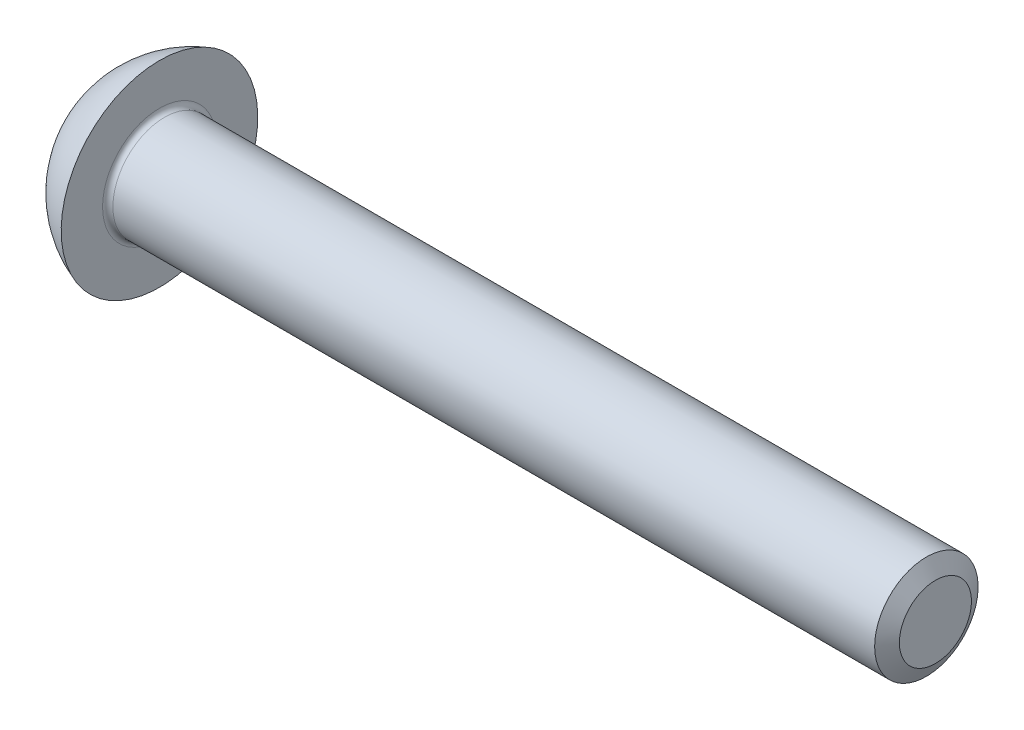
ISO-10303-21;
HEADER;
FILE_DESCRIPTION(('STEP AP214'),'2;1');
FILE_NAME('part.step','',(''),(''),'','','');
FILE_SCHEMA(('AUTOMOTIVE_DESIGN { 1 0 10303 214 1 1 1 1 }'));
ENDSEC;
DATA;
#1=APPLICATION_CONTEXT('core data for automotive mechanical design processes');
#2=APPLICATION_PROTOCOL_DEFINITION('international standard','automotive_design',2000,#1);
#3=PRODUCT_CONTEXT('',#1,'mechanical');
#4=PRODUCT('Part','Part','',(#3));
#5=PRODUCT_RELATED_PRODUCT_CATEGORY('part','',(#4));
#6=PRODUCT_DEFINITION_FORMATION('','',#4);
#7=PRODUCT_DEFINITION_CONTEXT('part definition',#1,'design');
#8=PRODUCT_DEFINITION('design','',#6,#7);
#9=PRODUCT_DEFINITION_SHAPE('','',#8);
#10=(LENGTH_UNIT() NAMED_UNIT(*) SI_UNIT(.MILLI.,.METRE.));
#11=(NAMED_UNIT(*) PLANE_ANGLE_UNIT() SI_UNIT($,.RADIAN.));
#12=(NAMED_UNIT(*) SI_UNIT($,.STERADIAN.) SOLID_ANGLE_UNIT());
#13=UNCERTAINTY_MEASURE_WITH_UNIT(LENGTH_MEASURE(1.E-05),#10,'distance_accuracy_value','');
#14=(GEOMETRIC_REPRESENTATION_CONTEXT(3) GLOBAL_UNCERTAINTY_ASSIGNED_CONTEXT((#13)) GLOBAL_UNIT_ASSIGNED_CONTEXT((#10,
#11,#12)) REPRESENTATION_CONTEXT('',''));
#15=CARTESIAN_POINT('',(0.,0.,0.));
#16=DIRECTION('',(0.,0.,1.));
#17=DIRECTION('',(1.,0.,0.));
#18=AXIS2_PLACEMENT_3D('',#15,#16,#17);
#19=CARTESIAN_POINT('',(-32.2,0.,0.));
#20=DIRECTION('',(-1.,0.,0.));
#21=DIRECTION('',(0.,0.,1.));
#22=AXIS2_PLACEMENT_3D('',#19,#20,#21);
#23=CYLINDRICAL_SURFACE('',#22,2.);
#24=CARTESIAN_POINT('',(-29.8,0.,0.));
#25=DIRECTION('',(-1.,0.,0.));
#26=DIRECTION('',(0.,0.,1.));
#27=AXIS2_PLACEMENT_3D('',#24,#25,#26);
#28=CIRCLE('',#27,2.);
#29=CARTESIAN_POINT('',(-29.8,0.,2.));
#30=VERTEX_POINT('',#29);
#31=EDGE_CURVE('E262',#30,#30,#28,.T.);
#32=ORIENTED_EDGE('',*,*,#31,.F.);
#33=EDGE_LOOP('',(#32));
#34=FACE_BOUND('',#33,.T.);
#35=CARTESIAN_POINT('',(-0.35,0.,0.));
#36=DIRECTION('',(-1.,0.,0.));
#37=DIRECTION('',(0.,0.,1.));
#38=AXIS2_PLACEMENT_3D('',#35,#36,#37);
#39=CIRCLE('',#38,2.);
#40=CARTESIAN_POINT('',(-0.35,0.,2.));
#41=VERTEX_POINT('',#40);
#42=EDGE_CURVE('E449',#41,#41,#39,.T.);
#43=ORIENTED_EDGE('',*,*,#42,.T.);
#44=EDGE_LOOP('',(#43));
#45=FACE_BOUND('',#44,.T.);
#46=ADVANCED_FACE('F41',(#34,#45),#23,.T.);
#47=CARTESIAN_POINT('',(-32.2,0.,0.));
#48=DIRECTION('',(1.,0.,0.));
#49=DIRECTION('',(0.,0.,-1.));
#50=AXIS2_PLACEMENT_3D('',#47,#48,#49);
#51=PLANE('',#50);
#52=CARTESIAN_POINT('',(-32.2,0.,0.));
#53=DIRECTION('',(-1.,0.,0.));
#54=DIRECTION('',(0.,0.,1.));
#55=AXIS2_PLACEMENT_3D('',#52,#53,#54);
#56=CIRCLE('',#55,2.);
#57=CARTESIAN_POINT('',(-32.2,2.,0.));
#58=VERTEX_POINT('',#57);
#59=EDGE_CURVE('E254',#58,#58,#56,.T.);
#60=ORIENTED_EDGE('',*,*,#59,.T.);
#61=EDGE_LOOP('',(#60));
#62=FACE_BOUND('',#61,.T.);
#63=CARTESIAN_POINT('',(-32.2,0.,0.));
#64=DIRECTION('',(1.,0.,0.));
#65=DIRECTION('',(0.,0.,-1.));
#66=AXIS2_PLACEMENT_3D('',#63,#64,#65);
#67=CIRCLE('',#66,1.44337567297406);
#68=CARTESIAN_POINT('',(-32.2,-0.721687836487033,-1.25));
#69=VERTEX_POINT('',#68);
#70=CARTESIAN_POINT('',(-32.2,-1.44337567297406,0.));
#71=VERTEX_POINT('',#70);
#72=EDGE_CURVE('E11',#69,#71,#67,.F.);
#73=ORIENTED_EDGE('',*,*,#72,.F.);
#74=CARTESIAN_POINT('',(-32.2,0.721687836487032,-1.25));
#75=VERTEX_POINT('',#74);
#76=EDGE_CURVE('E45',#75,#69,#67,.F.);
#77=ORIENTED_EDGE('',*,*,#76,.F.);
#78=CARTESIAN_POINT('',(-32.2,1.44337567297406,0.));
#79=VERTEX_POINT('',#78);
#80=EDGE_CURVE('E114',#79,#75,#67,.F.);
#81=ORIENTED_EDGE('',*,*,#80,.F.);
#82=CARTESIAN_POINT('',(-32.2,0.721687836487032,1.25));
#83=VERTEX_POINT('',#82);
#84=EDGE_CURVE('E327',#83,#79,#67,.F.);
#85=ORIENTED_EDGE('',*,*,#84,.F.);
#86=CARTESIAN_POINT('',(-32.2,-0.721687836487031,1.25));
#87=VERTEX_POINT('',#86);
#88=EDGE_CURVE('E50',#87,#83,#67,.F.);
#89=ORIENTED_EDGE('',*,*,#88,.F.);
#90=CARTESIAN_POINT('',(-32.2,0.,0.));
#91=DIRECTION('',(-1.,0.,0.));
#92=DIRECTION('',(0.,-1.,0.));
#93=AXIS2_PLACEMENT_3D('',#90,#91,#92);
#94=CIRCLE('',#93,1.44337567297406);
#95=EDGE_CURVE('E117',#71,#87,#94,.T.);
#96=ORIENTED_EDGE('',*,*,#95,.F.);
#97=EDGE_LOOP('',(#73,#77,#81,#85,#89,#96));
#98=FACE_BOUND('',#97,.T.);
#99=ADVANCED_FACE('F43',(#62,#98),#51,.F.);
#100=CARTESIAN_POINT('',(-28.7272727272727,0.,0.));
#101=DIRECTION('',(-1.,0.,0.));
#102=DIRECTION('',(0.,1.,0.));
#103=AXIS2_PLACEMENT_3D('',#100,#101,#102);
#104=SPHERICAL_SURFACE('',#103,4.00747235932374);
#105=CARTESIAN_POINT('',(-30.,0.,0.));
#106=DIRECTION('',(-1.,0.,0.));
#107=DIRECTION('',(0.,0.,1.));
#108=AXIS2_PLACEMENT_3D('',#105,#106,#107);
#109=CIRCLE('',#108,3.8);
#110=CARTESIAN_POINT('',(-30.,3.8,0.));
#111=VERTEX_POINT('',#110);
#112=EDGE_CURVE('E257',#111,#111,#109,.T.);
#113=CARTESIAN_POINT('',(-32.2,2.,0.));
#114=CARTESIAN_POINT('',(-32.1848940441993,2.02622955900731,0.));
#115=CARTESIAN_POINT('',(-32.1694908144314,2.05228791024859,0.));
#116=CARTESIAN_POINT('',(-32.1380979525594,2.10404896261472,0.));
#117=CARTESIAN_POINT('',(-32.1221083204554,2.12975166373959,0.));
#118=CARTESIAN_POINT('',(-32.0895507995097,2.18078818128854,0.));
#119=CARTESIAN_POINT('',(-32.072982910668,2.20612199771263,0.));
#120=CARTESIAN_POINT('',(-32.0392773993975,2.25640774959029,0.));
#121=CARTESIAN_POINT('',(-32.0221397769687,2.28135968504387,0.));
#122=CARTESIAN_POINT('',(-31.9873035925655,2.33086886166224,0.));
#123=CARTESIAN_POINT('',(-31.9696050305911,2.35542610282703,0.));
#124=CARTESIAN_POINT('',(-31.9336560549214,2.40413328370188,0.));
#125=CARTESIAN_POINT('',(-31.9154056412261,2.42828322341194,0.));
#126=CARTESIAN_POINT('',(-31.8783623317131,2.47616340238235,0.));
#127=CARTESIAN_POINT('',(-31.8595694358953,2.49989364164271,0.));
#128=CARTESIAN_POINT('',(-31.8214508106667,2.54692223644896,0.));
#129=CARTESIAN_POINT('',(-31.8021250812559,2.57022059199485,0.));
#130=CARTESIAN_POINT('',(-31.7629507108208,2.61637345777279,0.));
#131=CARTESIAN_POINT('',(-31.7431020697966,2.63922796800484,0.));
#132=CARTESIAN_POINT('',(-31.7028920666117,2.684481409448,0.));
#133=CARTESIAN_POINT('',(-31.682530704451,2.70688034065911,0.));
#134=CARTESIAN_POINT('',(-31.6413057126977,2.75121112424682,0.));
#135=CARTESIAN_POINT('',(-31.6204420831052,2.77314297662341,0.));
#136=CARTESIAN_POINT('',(-31.5782232680636,2.81652834253228,0.));
#137=CARTESIAN_POINT('',(-31.5568680826145,2.83798185606455,0.));
#138=CARTESIAN_POINT('',(-31.5136771198039,2.88039952985806,0.));
#139=CARTESIAN_POINT('',(-31.4918413424423,2.90136369011931,0.));
#140=CARTESIAN_POINT('',(-31.447700406491,2.94279189418254,0.));
#141=CARTESIAN_POINT('',(-31.4253952479013,2.96325593798452,0.));
#142=CARTESIAN_POINT('',(-31.3803270011625,3.00367340270524,0.));
#143=CARTESIAN_POINT('',(-31.3575639130134,3.02362682362399,0.));
#144=CARTESIAN_POINT('',(-31.3115914939299,3.06301279831263,0.));
#145=CARTESIAN_POINT('',(-31.2883821629955,3.08244535208254,0.));
#146=CARTESIAN_POINT('',(-31.2415291742204,3.12077961562579,0.));
#147=CARTESIAN_POINT('',(-31.2178855163797,3.13968132539914,0.));
#148=CARTESIAN_POINT('',(-31.1701760126585,3.17694419664163,0.));
#149=CARTESIAN_POINT('',(-31.1461101667779,3.19530535811078,0.));
#150=CARTESIAN_POINT('',(-31.0975686425984,3.23147770595957,0.));
#151=CARTESIAN_POINT('',(-31.0730929642995,3.24928889233922,0.));
#152=CARTESIAN_POINT('',(-31.0237443413165,3.28435214558591,0.));
#153=CARTESIAN_POINT('',(-30.9988713966324,3.30160421245294,0.));
#154=CARTESIAN_POINT('',(-30.9487410108723,3.3355403693082,0.));
#155=CARTESIAN_POINT('',(-30.9234835697963,3.35222445929642,0.));
#156=CARTESIAN_POINT('',(-30.8725971586496,3.38501609663248,0.));
#157=CARTESIAN_POINT('',(-30.846968188579,3.40112364398032,0.));
#158=CARTESIAN_POINT('',(-30.7953518775865,3.43275392627554,0.));
#159=CARTESIAN_POINT('',(-30.7693645366645,3.44827666122294,0.));
#160=CARTESIAN_POINT('',(-30.7170448261044,3.47872934920754,0.));
#161=CARTESIAN_POINT('',(-30.6907124564662,3.49365930224475,0.));
#162=CARTESIAN_POINT('',(-30.6377162077463,3.52291876123,0.));
#163=CARTESIAN_POINT('',(-30.6110523286645,3.53724826717803,0.));
#164=CARTESIAN_POINT('',(-30.5574067505418,3.56529947511373,0.));
#165=CARTESIAN_POINT('',(-30.5304250515009,3.57902117710138,0.));
#166=CARTESIAN_POINT('',(-30.4761576860719,3.60584973217452,0.));
#167=CARTESIAN_POINT('',(-30.4488720196837,3.61895658526001,0.));
#168=CARTESIAN_POINT('',(-30.3940107283966,3.6445487137135,0.));
#169=CARTESIAN_POINT('',(-30.3664351034975,3.65703398908152,0.));
#170=CARTESIAN_POINT('',(-30.3110080522769,3.6813765507008,0.));
#171=CARTESIAN_POINT('',(-30.2831566259553,3.69323383695206,0.));
#172=CARTESIAN_POINT('',(-30.2271922728732,3.71631433772655,0.));
#173=CARTESIAN_POINT('',(-30.1990793461126,3.72753755224977,0.));
#174=CARTESIAN_POINT('',(-30.1426064188229,3.74934412871163,0.));
#175=CARTESIAN_POINT('',(-30.1142464182937,3.75992749065027,0.));
#176=CARTESIAN_POINT('',(-30.0572939289701,3.78044899835327,0.));
#177=CARTESIAN_POINT('',(-30.0287014401756,3.79038714411763,0.));
#178=CARTESIAN_POINT('',(-30.,3.8,0.));
#179=B_SPLINE_CURVE_WITH_KNOTS('',3,(#113,#114,#115,#116,#117,#118,#119,#120,#121,#122,#123,
#124,#125,#126,#127,#128,#129,#130,#131,#132,#133,#134,#135,#136,#137,#138,#139,#140,#141,#142,
#143,#144,#145,#146,#147,#148,#149,#150,#151,#152,#153,#154,#155,#156,#157,#158,#159,#160,#161,
#162,#163,#164,#165,#166,#167,#168,#169,#170,#171,#172,#173,#174,#175,#176,#177,#178),
.UNSPECIFIED.,.F.,.F.,(4,2,2,2,2,2,2,2,2,2,2,2,2,2,2,2,2,2,2,2,2,2,2,2,2,2,2,2,2,2,2,2,4),(0.,
0.0908034330338798,0.181606866067759,0.272410299101639,0.36321373213552,0.454017165169397,
0.544820598203278,0.635624031237157,0.726427464271038,0.817230897304916,0.908034330338795,
0.998837763372676,1.08964119640655,1.18044462944043,1.27124806247431,1.36205149550819,
1.45285492854207,1.54365836157595,1.63446179460983,1.72526522764371,1.81606866067759,
1.90687209371147,1.99767552674535,2.08847895977923,2.17928239281311,2.27008582584699,
2.36088925888087,2.45169269191474,2.54249612494862,2.6332995579825,2.72410299101638,
2.81490642405026,2.90570985708414),.UNSPECIFIED.);
#180=EDGE_CURVE('BSEAM243',#58,#111,#179,.T.);
#181=ORIENTED_EDGE('',*,*,#59,.F.);
#182=ORIENTED_EDGE('',*,*,#112,.T.);
#183=ORIENTED_EDGE('',*,*,#180,.T.);
#184=ORIENTED_EDGE('',*,*,#180,.F.);
#185=EDGE_LOOP('',(#181,#183,#182,#184));
#186=FACE_BOUND('',#185,.T.);
#187=ADVANCED_FACE('F243',(#186),#104,.T.);
#188=CARTESIAN_POINT('',(-30.,2.2,0.));
#189=DIRECTION('',(-1.,0.,0.));
#190=DIRECTION('',(0.,0.,1.));
#191=AXIS2_PLACEMENT_3D('',#188,#189,#190);
#192=PLANE('',#191);
#193=ORIENTED_EDGE('',*,*,#112,.F.);
#194=EDGE_LOOP('',(#193));
#195=FACE_BOUND('',#194,.T.);
#196=CARTESIAN_POINT('',(-30.,0.,0.));
#197=DIRECTION('',(-1.,0.,0.));
#198=DIRECTION('',(0.,0.,1.));
#199=AXIS2_PLACEMENT_3D('',#196,#197,#198);
#200=CIRCLE('',#199,2.2);
#201=CARTESIAN_POINT('',(-30.,0.,2.2));
#202=VERTEX_POINT('',#201);
#203=EDGE_CURVE('E258',#202,#202,#200,.T.);
#204=ORIENTED_EDGE('',*,*,#203,.T.);
#205=EDGE_LOOP('',(#204));
#206=FACE_BOUND('',#205,.T.);
#207=ADVANCED_FACE('F240',(#195,#206),#192,.F.);
#208=CARTESIAN_POINT('',(-29.8,0.,0.));
#209=DIRECTION('',(-1.,0.,0.));
#210=DIRECTION('',(0.,0.,1.));
#211=AXIS2_PLACEMENT_3D('',#208,#209,#210);
#212=TOROIDAL_SURFACE('',#211,2.2,0.200000000000001);
#213=ORIENTED_EDGE('',*,*,#203,.F.);
#214=EDGE_LOOP('',(#213));
#215=FACE_BOUND('',#214,.T.);
#216=ORIENTED_EDGE('',*,*,#31,.T.);
#217=EDGE_LOOP('',(#216));
#218=FACE_BOUND('',#217,.T.);
#219=ADVANCED_FACE('F237',(#215,#218),#212,.F.);
#220=CARTESIAN_POINT('',(-31.83,0.,0.));
#221=DIRECTION('',(-1.,0.,0.));
#222=DIRECTION('',(0.,-1.,0.));
#223=AXIS2_PLACEMENT_3D('',#220,#221,#222);
#224=CONICAL_SURFACE('',#223,0.,1.31985626102756);
#225=CARTESIAN_POINT('',(-32.4099346759325,-1.88564456107599,-1.25));
#226=CARTESIAN_POINT('',(-32.3978717207476,-1.82917708741649,-1.25));
#227=CARTESIAN_POINT('',(-32.3859628503841,-1.7726766725723,-1.25));
#228=CARTESIAN_POINT('',(-32.3625309817374,-1.65959353753871,-1.25));
#229=CARTESIAN_POINT('',(-32.3510079994509,-1.60301081403846,-1.25));
#230=CARTESIAN_POINT('',(-32.3171150455956,-1.43301680255399,-1.25));
#231=CARTESIAN_POINT('',(-32.2954436732229,-1.31946408423816,-1.25));
#232=CARTESIAN_POINT('',(-32.2550957638519,-1.09274070822473,-1.25));
#233=CARTESIAN_POINT('',(-32.2363969731627,-0.979574090908787,-1.25));
#234=CARTESIAN_POINT('',(-32.2032623365578,-0.752620098767595,-1.25));
#235=CARTESIAN_POINT('',(-32.188825705465,-0.638832842215424,-1.25));
#236=CARTESIAN_POINT('',(-32.1660896767959,-0.409425109570645,-1.25));
#237=CARTESIAN_POINT('',(-32.1578544497063,-0.293797778292055,-1.25));
#238=CARTESIAN_POINT('',(-32.1515679025376,-0.120164512871691,-1.25));
#239=CARTESIAN_POINT('',(-32.150483164521,-0.06226279286971,-1.25));
#240=CARTESIAN_POINT('',(-32.1503795328621,0.0535425643634284,-1.25));
#241=CARTESIAN_POINT('',(-32.15136064136,0.11144620159651,-1.25));
#242=CARTESIAN_POINT('',(-32.1573598650309,0.285474295611227,-1.25));
#243=CARTESIAN_POINT('',(-32.1654487463646,0.401498867331895,-1.25));
#244=CARTESIAN_POINT('',(-32.1881044285101,0.632939913567419,-1.25));
#245=CARTESIAN_POINT('',(-32.2026754362751,0.748355943831211,-1.25));
#246=CARTESIAN_POINT('',(-32.2365518645336,0.980878548339561,-1.25));
#247=CARTESIAN_POINT('',(-32.2559479393881,1.09797147869704,-1.25));
#248=CARTESIAN_POINT('',(-32.2976947052089,1.33163516353435,-1.25));
#249=CARTESIAN_POINT('',(-32.3200458280349,1.44820583911091,-1.25));
#250=CARTESIAN_POINT('',(-32.3666691464558,1.68099121637415,-1.25));
#251=CARTESIAN_POINT('',(-32.3909418646374,1.7972058122361,-1.25));
#252=CARTESIAN_POINT('',(-32.4407644332086,2.02936144854685,-1.25));
#253=CARTESIAN_POINT('',(-32.4663143094331,2.14530248341221,-1.25));
#254=CARTESIAN_POINT('',(-32.518006571917,2.37571314631909,-1.25));
#255=CARTESIAN_POINT('',(-32.5441393559518,2.49018493743662,-1.25));
#256=CARTESIAN_POINT('',(-32.5970181249123,2.71898894131965,-1.25));
#257=CARTESIAN_POINT('',(-32.6237641225282,2.83332115114489,-1.25));
#258=CARTESIAN_POINT('',(-32.6776683130688,3.06173187864781,-1.25));
#259=CARTESIAN_POINT('',(-32.7048259274931,3.17581053313172,-1.25));
#260=CARTESIAN_POINT('',(-32.7594820608418,3.40388218743046,-1.25));
#261=CARTESIAN_POINT('',(-32.7869805683896,3.51787518996983,-1.25));
#262=CARTESIAN_POINT('',(-32.8145979060137,3.63183906574753,-1.25));
#263=B_SPLINE_CURVE_WITH_KNOTS('',3,(#225,#226,#227,#228,#229,#230,#231,#232,#233,#234,#235,
#236,#237,#238,#239,#240,#241,#242,#243,#244,#245,#246,#247,#248,#249,#250,#251,#252,#253,#254,
#255,#256,#257,#258,#259,#260,#261,#262),.UNSPECIFIED.,.F.,.F.,(4,2,2,2,2,2,2,2,2,2,2,2,2,2,2,2,
2,2,4),(0.,0.173224298995283,0.346455770019721,0.69323917118921,1.03728991141695,
1.38127723083866,1.72877689604066,1.90247833739643,2.07617995870962,2.42483219738435,
2.77371104508348,3.12971850144864,3.48577804345033,3.84193475233926,4.19809866864176,
4.55034691705481,4.90260246171337,5.25440194240086,5.60618971383706),.UNSPECIFIED.);
#264=EDGE_CURVE('E105',#69,#75,#263,.T.);
#265=ORIENTED_EDGE('',*,*,#264,.T.);
#266=ORIENTED_EDGE('',*,*,#76,.T.);
#267=EDGE_LOOP('',(#265,#266));
#268=FACE_BOUND('',#267,.T.);
#269=ADVANCED_FACE('F109',(#268),#224,.F.);
#270=CARTESIAN_POINT('',(-32.2000296035517,0.721572366433194,-1.2502));
#271=CARTESIAN_POINT('',(-32.1923376245114,0.751560236122211,-1.19825948608787));
#272=CARTESIAN_POINT('',(-32.1853558988612,0.781597955311094,-1.14623263030924));
#273=CARTESIAN_POINT('',(-32.1730912390252,0.841770545746216,-1.04201064645257));
#274=CARTESIAN_POINT('',(-32.1678089341386,0.871905448817342,-0.989815463252219));
#275=CARTESIAN_POINT('',(-32.1592477971586,0.932104975245319,-0.885546824887376));
#276=CARTESIAN_POINT('',(-32.1559596086559,0.96216925702196,-0.833473961357168));
#277=CARTESIAN_POINT('',(-32.1515506008694,1.0223329488635,-0.729267390316703));
#278=CARTESIAN_POINT('',(-32.1504293994002,1.05243235179702,-0.677133695158352));
#279=CARTESIAN_POINT('',(-32.1504293994002,1.11263115766407,-0.572866304841649));
#280=CARTESIAN_POINT('',(-32.1515506008694,1.1427305605976,-0.520732609683297));
#281=CARTESIAN_POINT('',(-32.1559596086559,1.20289425243914,-0.416526038642832));
#282=CARTESIAN_POINT('',(-32.1592477971586,1.23295853421578,-0.364453175112624));
#283=CARTESIAN_POINT('',(-32.1678089341386,1.29315806064375,-0.260184536747782));
#284=CARTESIAN_POINT('',(-32.1730912390252,1.32329296371488,-0.207989353547428));
#285=CARTESIAN_POINT('',(-32.1853558988612,1.38346555415,-0.103767369690763));
#286=CARTESIAN_POINT('',(-32.1923376245114,1.41350327333889,-0.0517405139121324));
#287=CARTESIAN_POINT('',(-32.2000296035517,1.4434911430279,0.000199999999999419));
#288=B_SPLINE_CURVE_WITH_KNOTS('',3,(#270,#271,#272,#273,#274,#275,#276,#277,#278,#279,#280,
#281,#282,#283,#284,#285,#286,#287),.UNSPECIFIED.,.F.,.F.,(4,2,2,2,2,2,2,2,4),(0.,
0.181409592460798,0.362886284169926,0.543504761741732,0.724091381228726,0.90467800071572,
1.08529647828753,1.26677316999665,1.44818276245745),.UNSPECIFIED.);
#289=EDGE_CURVE('E133',#75,#79,#288,.T.);
#290=ORIENTED_EDGE('',*,*,#289,.T.);
#291=ORIENTED_EDGE('',*,*,#80,.T.);
#292=EDGE_LOOP('',(#290,#291));
#293=FACE_BOUND('',#292,.T.);
#294=ADVANCED_FACE('F161',(#293),#224,.F.);
#295=CARTESIAN_POINT('',(-32.2000296035517,1.4434911430279,-0.00019999999999983));
#296=CARTESIAN_POINT('',(-32.1923376245114,1.41350327333889,0.0517405139121321));
#297=CARTESIAN_POINT('',(-32.1853558988612,1.38346555415,0.103767369690763));
#298=CARTESIAN_POINT('',(-32.1730912390252,1.32329296371488,0.207989353547427));
#299=CARTESIAN_POINT('',(-32.1678089341386,1.29315806064375,0.260184536747781));
#300=CARTESIAN_POINT('',(-32.1592477971586,1.23295853421578,0.364453175112623));
#301=CARTESIAN_POINT('',(-32.1559596086559,1.20289425243914,0.416526038642832));
#302=CARTESIAN_POINT('',(-32.1515506008694,1.1427305605976,0.520732609683296));
#303=CARTESIAN_POINT('',(-32.1504293994002,1.11263115766407,0.572866304841648));
#304=CARTESIAN_POINT('',(-32.1504293994002,1.05243235179702,0.677133695158351));
#305=CARTESIAN_POINT('',(-32.1515506008694,1.0223329488635,0.729267390316703));
#306=CARTESIAN_POINT('',(-32.1559596086559,0.96216925702196,0.833473961357167));
#307=CARTESIAN_POINT('',(-32.1592477971586,0.93210497524532,0.885546824887375));
#308=CARTESIAN_POINT('',(-32.1678089341386,0.871905448817342,0.989815463252218));
#309=CARTESIAN_POINT('',(-32.1730912390252,0.841770545746216,1.04201064645257));
#310=CARTESIAN_POINT('',(-32.1853558988612,0.781597955311094,1.14623263030924));
#311=CARTESIAN_POINT('',(-32.1923376245114,0.751560236122212,1.19825948608787));
#312=CARTESIAN_POINT('',(-32.2000296035517,0.721572366433195,1.2502));
#313=B_SPLINE_CURVE_WITH_KNOTS('',3,(#295,#296,#297,#298,#299,#300,#301,#302,#303,#304,#305,
#306,#307,#308,#309,#310,#311,#312),.UNSPECIFIED.,.F.,.F.,(4,2,2,2,2,2,2,2,4),(0.,
0.181409592460798,0.362886284169926,0.543504761741731,0.724091381228726,0.904678000715719,
1.08529647828752,1.26677316999665,1.44818276245745),.UNSPECIFIED.);
#314=EDGE_CURVE('E183',#79,#83,#313,.T.);
#315=ORIENTED_EDGE('',*,*,#314,.T.);
#316=ORIENTED_EDGE('',*,*,#84,.T.);
#317=EDGE_LOOP('',(#315,#316));
#318=FACE_BOUND('',#317,.T.);
#319=ADVANCED_FACE('F155',(#318),#224,.F.);
#320=CARTESIAN_POINT('',(-32.4099346759325,-1.88564456107599,1.25));
#321=CARTESIAN_POINT('',(-32.3978717207476,-1.82917708741649,1.25));
#322=CARTESIAN_POINT('',(-32.3859628503841,-1.7726766725723,1.25));
#323=CARTESIAN_POINT('',(-32.3625309817374,-1.65959353753871,1.25));
#324=CARTESIAN_POINT('',(-32.3510079994509,-1.60301081403846,1.25));
#325=CARTESIAN_POINT('',(-32.3171150455956,-1.43301680255399,1.25));
#326=CARTESIAN_POINT('',(-32.2954436732229,-1.31946408423816,1.25));
#327=CARTESIAN_POINT('',(-32.2550957638519,-1.09274070822473,1.25));
#328=CARTESIAN_POINT('',(-32.2363969731627,-0.979574090908786,1.25));
#329=CARTESIAN_POINT('',(-32.2032623365578,-0.752620098767593,1.25));
#330=CARTESIAN_POINT('',(-32.188825705465,-0.638832842215423,1.25));
#331=CARTESIAN_POINT('',(-32.1660896767959,-0.409425109570646,1.25));
#332=CARTESIAN_POINT('',(-32.1578544497063,-0.293797778292056,1.25));
#333=CARTESIAN_POINT('',(-32.1515679025376,-0.120164512871691,1.25));
#334=CARTESIAN_POINT('',(-32.150483164521,-0.0622627928697106,1.25));
#335=CARTESIAN_POINT('',(-32.1503795328621,0.0535425643634277,1.25));
#336=CARTESIAN_POINT('',(-32.15136064136,0.111446201596509,1.25));
#337=CARTESIAN_POINT('',(-32.1573598650309,0.285474295611226,1.25));
#338=CARTESIAN_POINT('',(-32.1654487463646,0.401498867331894,1.25));
#339=CARTESIAN_POINT('',(-32.1881044285101,0.632939913567419,1.25));
#340=CARTESIAN_POINT('',(-32.2026754362751,0.748355943831211,1.25));
#341=CARTESIAN_POINT('',(-32.2365518645336,0.980878548339561,1.25));
#342=CARTESIAN_POINT('',(-32.2559479393881,1.09797147869704,1.25));
#343=CARTESIAN_POINT('',(-32.2976947052089,1.33163516353435,1.25));
#344=CARTESIAN_POINT('',(-32.3200458280349,1.44820583911091,1.25));
#345=CARTESIAN_POINT('',(-32.3666691464558,1.68099121637415,1.25));
#346=CARTESIAN_POINT('',(-32.3909418646374,1.7972058122361,1.25));
#347=CARTESIAN_POINT('',(-32.4407644332086,2.02936144854685,1.25));
#348=CARTESIAN_POINT('',(-32.4663143094331,2.14530248341221,1.25));
#349=CARTESIAN_POINT('',(-32.518006571917,2.37571314631909,1.25));
#350=CARTESIAN_POINT('',(-32.5441393559518,2.49018493743662,1.25));
#351=CARTESIAN_POINT('',(-32.5970181249123,2.71898894131965,1.25));
#352=CARTESIAN_POINT('',(-32.6237641225282,2.83332115114489,1.25));
#353=CARTESIAN_POINT('',(-32.6776683130688,3.06173187864781,1.25));
#354=CARTESIAN_POINT('',(-32.7048259274931,3.17581053313172,1.25));
#355=CARTESIAN_POINT('',(-32.7594820608418,3.40388218743046,1.25));
#356=CARTESIAN_POINT('',(-32.7869805683896,3.51787518996983,1.25));
#357=CARTESIAN_POINT('',(-32.8145979060137,3.63183906574753,1.25));
#358=B_SPLINE_CURVE_WITH_KNOTS('',3,(#320,#321,#322,#323,#324,#325,#326,#327,#328,#329,#330,
#331,#332,#333,#334,#335,#336,#337,#338,#339,#340,#341,#342,#343,#344,#345,#346,#347,#348,#349,
#350,#351,#352,#353,#354,#355,#356,#357),.UNSPECIFIED.,.F.,.F.,(4,2,2,2,2,2,2,2,2,2,2,2,2,2,2,2,
2,2,4),(0.,0.173224298995283,0.346455770019721,0.69323917118921,1.03728991141696,
1.38127723083866,1.72877689604066,1.90247833739643,2.07617995870962,2.42483219738435,
2.77371104508348,3.12971850144864,3.48577804345033,3.84193475233926,4.19809866864176,
4.55034691705481,4.90260246171337,5.25440194240086,5.60618971383706),.UNSPECIFIED.);
#359=EDGE_CURVE('E62',#83,#87,#358,.F.);
#360=ORIENTED_EDGE('',*,*,#359,.T.);
#361=ORIENTED_EDGE('',*,*,#88,.T.);
#362=EDGE_LOOP('',(#360,#361));
#363=FACE_BOUND('',#362,.T.);
#364=ADVANCED_FACE('F160',(#363),#224,.F.);
#365=CARTESIAN_POINT('',(-32.2000296035517,-0.721572366433195,1.2502));
#366=CARTESIAN_POINT('',(-32.1923376245114,-0.751560236122212,1.19825948608787));
#367=CARTESIAN_POINT('',(-32.1853558988612,-0.781597955311095,1.14623263030924));
#368=CARTESIAN_POINT('',(-32.1730912390252,-0.841770545746217,1.04201064645257));
#369=CARTESIAN_POINT('',(-32.1678089341386,-0.871905448817343,0.989815463252219));
#370=CARTESIAN_POINT('',(-32.1592477971586,-0.93210497524532,0.885546824887376));
#371=CARTESIAN_POINT('',(-32.1559596086559,-0.962169257021961,0.833473961357168));
#372=CARTESIAN_POINT('',(-32.1515506008694,-1.0223329488635,0.729267390316703));
#373=CARTESIAN_POINT('',(-32.1504293994002,-1.05243235179702,0.677133695158351));
#374=CARTESIAN_POINT('',(-32.1504293994002,-1.11263115766407,0.572866304841648));
#375=CARTESIAN_POINT('',(-32.1515506008694,-1.1427305605976,0.520732609683297));
#376=CARTESIAN_POINT('',(-32.1559596086559,-1.20289425243914,0.416526038642832));
#377=CARTESIAN_POINT('',(-32.1592477971586,-1.23295853421578,0.364453175112623));
#378=CARTESIAN_POINT('',(-32.1678089341386,-1.29315806064376,0.260184536747781));
#379=CARTESIAN_POINT('',(-32.1730912390252,-1.32329296371488,0.207989353547428));
#380=CARTESIAN_POINT('',(-32.1853558988612,-1.38346555415,0.103767369690763));
#381=CARTESIAN_POINT('',(-32.1923376245114,-1.41350327333889,0.0517405139121318));
#382=CARTESIAN_POINT('',(-32.2000296035517,-1.4434911430279,-0.000200000000000009));
#383=B_SPLINE_CURVE_WITH_KNOTS('',3,(#365,#366,#367,#368,#369,#370,#371,#372,#373,#374,#375,
#376,#377,#378,#379,#380,#381,#382),.UNSPECIFIED.,.F.,.F.,(4,2,2,2,2,2,2,2,4),(0.,
0.181409592460797,0.362886284169926,0.543504761741732,0.724091381228726,0.90467800071572,
1.08529647828753,1.26677316999665,1.44818276245745),.UNSPECIFIED.);
#384=EDGE_CURVE('E56',#87,#71,#383,.T.);
#385=ORIENTED_EDGE('',*,*,#384,.T.);
#386=ORIENTED_EDGE('',*,*,#95,.T.);
#387=EDGE_LOOP('',(#385,#386));
#388=FACE_BOUND('',#387,.T.);
#389=ADVANCED_FACE('F314',(#388),#224,.F.);
#390=CARTESIAN_POINT('',(-32.2000296035517,-1.4434911430279,0.000199999999999256));
#391=CARTESIAN_POINT('',(-32.1923376245114,-1.41350327333889,-0.0517405139121324));
#392=CARTESIAN_POINT('',(-32.1853558988612,-1.38346555415,-0.103767369690763));
#393=CARTESIAN_POINT('',(-32.1730912390252,-1.32329296371488,-0.207989353547428));
#394=CARTESIAN_POINT('',(-32.1678089341386,-1.29315806064376,-0.260184536747782));
#395=CARTESIAN_POINT('',(-32.1592477971586,-1.23295853421578,-0.364453175112624));
#396=CARTESIAN_POINT('',(-32.1559596086559,-1.20289425243914,-0.416526038642832));
#397=CARTESIAN_POINT('',(-32.1515506008694,-1.1427305605976,-0.520732609683297));
#398=CARTESIAN_POINT('',(-32.1504293994002,-1.11263115766407,-0.572866304841649));
#399=CARTESIAN_POINT('',(-32.1504293994002,-1.05243235179703,-0.677133695158352));
#400=CARTESIAN_POINT('',(-32.1515506008694,-1.0223329488635,-0.729267390316703));
#401=CARTESIAN_POINT('',(-32.1559596086559,-0.962169257021961,-0.833473961357168));
#402=CARTESIAN_POINT('',(-32.1592477971586,-0.93210497524532,-0.885546824887376));
#403=CARTESIAN_POINT('',(-32.1678089341386,-0.871905448817343,-0.989815463252219));
#404=CARTESIAN_POINT('',(-32.1730912390252,-0.841770545746217,-1.04201064645257));
#405=CARTESIAN_POINT('',(-32.1853558988612,-0.781597955311095,-1.14623263030924));
#406=CARTESIAN_POINT('',(-32.1923376245114,-0.751560236122212,-1.19825948608787));
#407=CARTESIAN_POINT('',(-32.2000296035517,-0.721572366433195,-1.2502));
#408=B_SPLINE_CURVE_WITH_KNOTS('',3,(#390,#391,#392,#393,#394,#395,#396,#397,#398,#399,#400,
#401,#402,#403,#404,#405,#406,#407),.UNSPECIFIED.,.F.,.F.,(4,2,2,2,2,2,2,2,4),(0.,
0.181409592460797,0.362886284169926,0.543504761741732,0.724091381228726,0.90467800071572,
1.08529647828752,1.26677316999665,1.44818276245745),.UNSPECIFIED.);
#409=EDGE_CURVE('E97',#71,#69,#408,.T.);
#410=ORIENTED_EDGE('',*,*,#409,.T.);
#411=ORIENTED_EDGE('',*,*,#72,.T.);
#412=EDGE_LOOP('',(#410,#411));
#413=FACE_BOUND('',#412,.T.);
#414=ADVANCED_FACE('F99',(#413),#224,.F.);
#415=CARTESIAN_POINT('',(-30.9,0.,0.));
#416=DIRECTION('',(-1.,0.,0.));
#417=DIRECTION('',(0.,0.,1.));
#418=AXIS2_PLACEMENT_3D('',#415,#416,#417);
#419=CONICAL_SURFACE('',#418,1.44337567297406,1.01324881882863);
#420=CARTESIAN_POINT('',(-30.,0.,0.));
#421=VERTEX_POINT('',#420);
#422=VERTEX_LOOP('',#421);
#423=FACE_BOUND('',#422,.T.);
#424=CARTESIAN_POINT('',(-31.3527945795421,-1.77325319370587,1.25));
#425=CARTESIAN_POINT('',(-31.3272313608337,-1.72308054748254,1.25));
#426=CARTESIAN_POINT('',(-31.3019425610441,-1.67276579739611,1.25));
#427=CARTESIAN_POINT('',(-31.2520602884769,-1.57178113050656,1.25));
#428=CARTESIAN_POINT('',(-31.2274669508561,-1.52111114702254,1.25));
#429=CARTESIAN_POINT('',(-31.1789832389279,-1.41905106562435,1.25));
#430=CARTESIAN_POINT('',(-31.1550981267071,-1.36765845463947,1.25));
#431=CARTESIAN_POINT('',(-31.1084115654387,-1.26438731533743,1.25));
#432=CARTESIAN_POINT('',(-31.0856100580289,-1.21250881337054,1.25));
#433=CARTESIAN_POINT('',(-31.0180066296141,-1.05318865262781,1.25));
#434=CARTESIAN_POINT('',(-30.975348048821,-0.944818595736525,1.25));
#435=CARTESIAN_POINT('',(-30.899249765014,-0.725021793662279,1.25));
#436=CARTESIAN_POINT('',(-30.8657864364544,-0.613603706258271,1.25));
#437=CARTESIAN_POINT('',(-30.8255224000706,-0.439829475428557,1.25));
#438=CARTESIAN_POINT('',(-30.8135539759356,-0.378686784718629,1.25));
#439=CARTESIAN_POINT('',(-30.7946834115852,-0.255611326700577,1.25));
#440=CARTESIAN_POINT('',(-30.7877804723348,-0.19367868556883,1.25));
#441=CARTESIAN_POINT('',(-30.7797277447971,-0.0702459018996858,1.25));
#442=CARTESIAN_POINT('',(-30.7785036595021,-0.00875074655362735,1.25));
#443=CARTESIAN_POINT('',(-30.7817252928589,0.114091468273714,1.25));
#444=CARTESIAN_POINT('',(-30.7861717520863,0.175438507362529,1.25));
#445=CARTESIAN_POINT('',(-30.802790821166,0.318793774562431,1.25));
#446=CARTESIAN_POINT('',(-30.8171162097553,0.400550507800211,1.25));
#447=CARTESIAN_POINT('',(-30.8533604743273,0.56235775953531,1.25));
#448=CARTESIAN_POINT('',(-30.8752859853004,0.642406722094854,1.25));
#449=CARTESIAN_POINT('',(-30.9252263796582,0.802612605575799,1.25));
#450=CARTESIAN_POINT('',(-30.9533725953862,0.882727610112281,1.25));
#451=CARTESIAN_POINT('',(-31.0137044102596,1.04136692759758,1.25));
#452=CARTESIAN_POINT('',(-31.0458888175979,1.11989170196819,1.25));
#453=CARTESIAN_POINT('',(-31.1085113010088,1.26504456834479,1.25));
#454=CARTESIAN_POINT('',(-31.1385863298607,1.33183108575291,1.25));
#455=CARTESIAN_POINT('',(-31.2003370421044,1.46466259424516,1.25));
#456=CARTESIAN_POINT('',(-31.2320128472902,1.53070752843774,1.25));
#457=CARTESIAN_POINT('',(-31.3288612944515,1.72800114412657,1.25));
#458=CARTESIAN_POINT('',(-31.3958346146514,1.85836304165698,1.25));
#459=CARTESIAN_POINT('',(-31.5327729293065,2.11775589592146,1.25));
#460=CARTESIAN_POINT('',(-31.6027425964556,2.24678435317969,1.25));
#461=CARTESIAN_POINT('',(-31.7445495255551,2.50377456749809,1.25));
#462=CARTESIAN_POINT('',(-31.8163864088467,2.63173653399052,1.25));
#463=CARTESIAN_POINT('',(-31.9535702802704,2.87326192040095,1.25));
#464=CARTESIAN_POINT('',(-32.0187879458601,2.98689907544955,1.25));
#465=CARTESIAN_POINT('',(-32.1499753350723,3.21374706697092,1.25));
#466=CARTESIAN_POINT('',(-32.2159451030052,3.32695787779727,1.25));
#467=CARTESIAN_POINT('',(-32.3482234067217,3.55267191020501,1.25));
#468=CARTESIAN_POINT('',(-32.4145300682268,3.66517623176316,1.25));
#469=CARTESIAN_POINT('',(-32.5475751113016,3.8899176768681,1.25));
#470=CARTESIAN_POINT('',(-32.6143134591135,4.00215482039119,1.25));
#471=CARTESIAN_POINT('',(-32.6812102093033,4.11429687203232,1.25));
#472=B_SPLINE_CURVE_WITH_KNOTS('',3,(#424,#425,#426,#427,#428,#429,#430,#431,#432,#433,#434,
#435,#436,#437,#438,#439,#440,#441,#442,#443,#444,#445,#446,#447,#448,#449,#450,#451,#452,#453,
#454,#455,#456,#457,#458,#459,#460,#461,#462,#463,#464,#465,#466,#467,#468,#469,#470,#471),
.UNSPECIFIED.,.F.,.F.,(4,2,2,2,2,2,2,2,2,2,2,2,2,2,2,2,2,2,2,2,2,2,2,4),(0.,0.168930888086684,
0.337894383813143,0.50789846348262,0.67789337646512,1.0270708628597,1.3753426286684,
1.56207832532889,1.74878455976038,1.93304107769939,2.11732166208064,2.36583389677495,
2.61456363408265,2.86915526427585,3.12367193182966,3.34338375168395,3.56311231342189,
4.00271912781841,4.44303841363042,4.88326909182565,5.27633168545271,5.66941755741552,
6.06118706475326,6.45292629749501),.UNSPECIFIED.);
#473=CARTESIAN_POINT('',(-30.9,-0.721687836487033,1.25));
#474=VERTEX_POINT('',#473);
#475=CARTESIAN_POINT('',(-30.9,0.721687836487032,1.25));
#476=VERTEX_POINT('',#475);
#477=EDGE_CURVE('E199',#474,#476,#472,.T.);
#478=ORIENTED_EDGE('',*,*,#477,.T.);
#479=CARTESIAN_POINT('',(-30.9000720086393,0.721572366433195,1.2502));
#480=CARTESIAN_POINT('',(-30.8801448426332,0.753515397677925,1.19487304693637));
#481=CARTESIAN_POINT('',(-30.8620045541367,0.785780040598703,1.13898904610951));
#482=CARTESIAN_POINT('',(-30.8303569142874,0.850965440737864,1.02608462115678));
#483=CARTESIAN_POINT('',(-30.8168631745157,0.883887831667606,0.969061367359819));
#484=CARTESIAN_POINT('',(-30.7960025510557,0.949256047226193,0.855840296812232));
#485=CARTESIAN_POINT('',(-30.7884697729694,0.981688121259105,0.799666296792393));
#486=CARTESIAN_POINT('',(-30.7796634350083,1.04672261963105,0.687023241367426));
#487=CARTESIAN_POINT('',(-30.7783805168214,1.07932471605452,0.630554753928727));
#488=CARTESIAN_POINT('',(-30.7819049641253,1.13967644186336,0.526022498503348));
#489=CARTESIAN_POINT('',(-30.7858507725259,1.167439811789,0.477934931202805));
#490=CARTESIAN_POINT('',(-30.7980757188124,1.22275387862577,0.382128157068256));
#491=CARTESIAN_POINT('',(-30.8063595984706,1.25030430927563,0.334409411412304));
#492=CARTESIAN_POINT('',(-30.826962668364,1.30574431848064,0.238384498697139));
#493=CARTESIAN_POINT('',(-30.8393795573722,1.333624575995,0.19009447615415));
#494=CARTESIAN_POINT('',(-30.8674628627124,1.38890731580299,0.0943419620251044));
#495=CARTESIAN_POINT('',(-30.8831216709794,1.41631075671776,0.0468778100585216));
#496=CARTESIAN_POINT('',(-30.9000720086393,1.4434911430279,-0.000200000000000017));
#497=B_SPLINE_CURVE_WITH_KNOTS('',3,(#479,#480,#481,#482,#483,#484,#485,#486,#487,#488,#489,
#490,#491,#492,#493,#494,#495,#496),.UNSPECIFIED.,.F.,.F.,(4,2,2,2,2,2,2,2,4),(0.,
0.200864252203224,0.402312007110811,0.597934215834184,0.793263416779519,0.960084042532227,
1.12708739503102,1.29835788316976,1.46923090317111),.UNSPECIFIED.);
#498=CARTESIAN_POINT('',(-30.9,1.44337567297406,0.));
#499=VERTEX_POINT('',#498);
#500=EDGE_CURVE('E207',#476,#499,#497,.T.);
#501=ORIENTED_EDGE('',*,*,#500,.T.);
#502=CARTESIAN_POINT('',(-30.9000720086393,1.4434911430279,0.000199999999999767));
#503=CARTESIAN_POINT('',(-30.8801448426332,1.41154811178317,-0.055126953063633));
#504=CARTESIAN_POINT('',(-30.8620045541367,1.37928346886239,-0.111010953890489));
#505=CARTESIAN_POINT('',(-30.8303569142874,1.31409806872323,-0.223915378843222));
#506=CARTESIAN_POINT('',(-30.8168631745157,1.28117567779349,-0.280938632640181));
#507=CARTESIAN_POINT('',(-30.7960025510557,1.2158074622349,-0.394159703187767));
#508=CARTESIAN_POINT('',(-30.7884697729694,1.18337538820199,-0.450333703207607));
#509=CARTESIAN_POINT('',(-30.7796634350083,1.11834088983005,-0.562976758632573));
#510=CARTESIAN_POINT('',(-30.7783805168214,1.08573879340658,-0.619445246071272));
#511=CARTESIAN_POINT('',(-30.7819049641253,1.02538706759774,-0.723977501496652));
#512=CARTESIAN_POINT('',(-30.7858507725259,0.997623697672097,-0.772065068797194));
#513=CARTESIAN_POINT('',(-30.7980757188124,0.942309630835326,-0.867871842931743));
#514=CARTESIAN_POINT('',(-30.8063595984706,0.914759200185471,-0.915590588587695));
#515=CARTESIAN_POINT('',(-30.826962668364,0.85931919098046,-1.01161550130286));
#516=CARTESIAN_POINT('',(-30.8393795573722,0.831438933466092,-1.05990552384585));
#517=CARTESIAN_POINT('',(-30.8674628627124,0.776156193658104,-1.1556580379749));
#518=CARTESIAN_POINT('',(-30.8831216709794,0.74875275274334,-1.20312218994148));
#519=CARTESIAN_POINT('',(-30.9000720086393,0.721572366433194,-1.2502));
#520=B_SPLINE_CURVE_WITH_KNOTS('',3,(#502,#503,#504,#505,#506,#507,#508,#509,#510,#511,#512,
#513,#514,#515,#516,#517,#518,#519),.UNSPECIFIED.,.F.,.F.,(4,2,2,2,2,2,2,2,4),(0.,
0.200864252203224,0.402312007110811,0.597934215834184,0.793263416779519,0.960084042532226,
1.12708739503102,1.29835788316976,1.46923090317111),.UNSPECIFIED.);
#521=CARTESIAN_POINT('',(-30.9,0.721687836487033,-1.25));
#522=VERTEX_POINT('',#521);
#523=EDGE_CURVE('E115',#499,#522,#520,.T.);
#524=ORIENTED_EDGE('',*,*,#523,.T.);
#525=CARTESIAN_POINT('',(-31.3527945795421,-1.77325319370587,-1.25));
#526=CARTESIAN_POINT('',(-31.3272313608337,-1.72308054748254,-1.25));
#527=CARTESIAN_POINT('',(-31.3019425610441,-1.67276579739611,-1.25));
#528=CARTESIAN_POINT('',(-31.2520602884769,-1.57178113050656,-1.25));
#529=CARTESIAN_POINT('',(-31.2274669508561,-1.52111114702254,-1.25));
#530=CARTESIAN_POINT('',(-31.1789832389279,-1.41905106562435,-1.25));
#531=CARTESIAN_POINT('',(-31.1550981267071,-1.36765845463947,-1.25));
#532=CARTESIAN_POINT('',(-31.1084115654387,-1.26438731533743,-1.25));
#533=CARTESIAN_POINT('',(-31.0856100580289,-1.21250881337054,-1.25));
#534=CARTESIAN_POINT('',(-31.0180066296141,-1.05318865262781,-1.25));
#535=CARTESIAN_POINT('',(-30.975348048821,-0.944818595736523,-1.25));
#536=CARTESIAN_POINT('',(-30.899249765014,-0.725021793662277,-1.25));
#537=CARTESIAN_POINT('',(-30.8657864364544,-0.613603706258271,-1.25));
#538=CARTESIAN_POINT('',(-30.8255224000706,-0.439829475428558,-1.25));
#539=CARTESIAN_POINT('',(-30.8135539759356,-0.378686784718629,-1.25));
#540=CARTESIAN_POINT('',(-30.7946834115852,-0.255611326700577,-1.25));
#541=CARTESIAN_POINT('',(-30.7877804723348,-0.19367868556883,-1.25));
#542=CARTESIAN_POINT('',(-30.7797277447971,-0.0702459018996855,-1.25));
#543=CARTESIAN_POINT('',(-30.7785036595021,-0.00875074655362693,-1.25));
#544=CARTESIAN_POINT('',(-30.7817252928589,0.114091468273714,-1.25));
#545=CARTESIAN_POINT('',(-30.7861717520863,0.17543850736253,-1.25));
#546=CARTESIAN_POINT('',(-30.802790821166,0.318793774562432,-1.25));
#547=CARTESIAN_POINT('',(-30.8171162097553,0.400550507800212,-1.25));
#548=CARTESIAN_POINT('',(-30.8533604743273,0.56235775953531,-1.25));
#549=CARTESIAN_POINT('',(-30.8752859853004,0.642406722094854,-1.25));
#550=CARTESIAN_POINT('',(-30.9252263796581,0.802612605575799,-1.25));
#551=CARTESIAN_POINT('',(-30.9533725953862,0.882727610112282,-1.25));
#552=CARTESIAN_POINT('',(-31.0137044102596,1.04136692759758,-1.25));
#553=CARTESIAN_POINT('',(-31.0458888175979,1.11989170196819,-1.25));
#554=CARTESIAN_POINT('',(-31.1085113010088,1.26504456834479,-1.25));
#555=CARTESIAN_POINT('',(-31.1385863298607,1.33183108575291,-1.25));
#556=CARTESIAN_POINT('',(-31.2003370421044,1.46466259424516,-1.25));
#557=CARTESIAN_POINT('',(-31.2320128472902,1.53070752843774,-1.25));
#558=CARTESIAN_POINT('',(-31.3288612944515,1.72800114412657,-1.25));
#559=CARTESIAN_POINT('',(-31.3958346146514,1.85836304165698,-1.25));
#560=CARTESIAN_POINT('',(-31.5327729293065,2.11775589592146,-1.25));
#561=CARTESIAN_POINT('',(-31.6027425964556,2.24678435317969,-1.25));
#562=CARTESIAN_POINT('',(-31.7445495255551,2.50377456749809,-1.25));
#563=CARTESIAN_POINT('',(-31.8163864088467,2.63173653399052,-1.25));
#564=CARTESIAN_POINT('',(-31.9535702802704,2.87326192040095,-1.25));
#565=CARTESIAN_POINT('',(-32.0187879458601,2.98689907544955,-1.25));
#566=CARTESIAN_POINT('',(-32.1499753350723,3.21374706697092,-1.25));
#567=CARTESIAN_POINT('',(-32.2159451030052,3.32695787779727,-1.25));
#568=CARTESIAN_POINT('',(-32.3482234067217,3.55267191020501,-1.25));
#569=CARTESIAN_POINT('',(-32.4145300682268,3.66517623176316,-1.25));
#570=CARTESIAN_POINT('',(-32.5475751113016,3.8899176768681,-1.25));
#571=CARTESIAN_POINT('',(-32.6143134591135,4.00215482039119,-1.25));
#572=CARTESIAN_POINT('',(-32.6812102093033,4.11429687203232,-1.25));
#573=B_SPLINE_CURVE_WITH_KNOTS('',3,(#525,#526,#527,#528,#529,#530,#531,#532,#533,#534,#535,
#536,#537,#538,#539,#540,#541,#542,#543,#544,#545,#546,#547,#548,#549,#550,#551,#552,#553,#554,
#555,#556,#557,#558,#559,#560,#561,#562,#563,#564,#565,#566,#567,#568,#569,#570,#571,#572),
.UNSPECIFIED.,.F.,.F.,(4,2,2,2,2,2,2,2,2,2,2,2,2,2,2,2,2,2,2,2,2,2,2,4),(0.,0.168930888086684,
0.337894383813143,0.507898463482619,0.677893376465119,1.0270708628597,1.37534262866839,
1.56207832532889,1.74878455976038,1.93304107769939,2.11732166208064,2.36583389677495,
2.61456363408265,2.86915526427585,3.12367193182965,3.34338375168395,3.56311231342189,
4.0027191278184,4.44303841363042,4.88326909182565,5.27633168545271,5.66941755741552,
6.06118706475326,6.45292629749501),.UNSPECIFIED.);
#574=CARTESIAN_POINT('',(-30.9,-0.721687836487033,-1.25));
#575=VERTEX_POINT('',#574);
#576=EDGE_CURVE('E271',#522,#575,#573,.F.);
#577=ORIENTED_EDGE('',*,*,#576,.T.);
#578=CARTESIAN_POINT('',(-30.9000720086393,-0.721572366433195,-1.2502));
#579=CARTESIAN_POINT('',(-30.8801448426332,-0.753515397677925,-1.19487304693637));
#580=CARTESIAN_POINT('',(-30.8620045541367,-0.785780040598704,-1.13898904610951));
#581=CARTESIAN_POINT('',(-30.8303569142874,-0.850965440737864,-1.02608462115678));
#582=CARTESIAN_POINT('',(-30.8168631745157,-0.883887831667607,-0.969061367359819));
#583=CARTESIAN_POINT('',(-30.7960025510557,-0.949256047226193,-0.855840296812233));
#584=CARTESIAN_POINT('',(-30.7884697729694,-0.981688121259106,-0.799666296792394));
#585=CARTESIAN_POINT('',(-30.7796634350083,-1.04672261963105,-0.687023241367427));
#586=CARTESIAN_POINT('',(-30.7783805168214,-1.07932471605452,-0.630554753928728));
#587=CARTESIAN_POINT('',(-30.7819049641253,-1.13967644186336,-0.526022498503349));
#588=CARTESIAN_POINT('',(-30.7858507725259,-1.167439811789,-0.477934931202807));
#589=CARTESIAN_POINT('',(-30.7980757188124,-1.22275387862577,-0.382128157068258));
#590=CARTESIAN_POINT('',(-30.8063595984706,-1.25030430927563,-0.334409411412306));
#591=CARTESIAN_POINT('',(-30.826962668364,-1.30574431848064,-0.238384498697141));
#592=CARTESIAN_POINT('',(-30.8393795573722,-1.333624575995,-0.190094476154152));
#593=CARTESIAN_POINT('',(-30.8674628627124,-1.38890731580299,-0.0943419620251063));
#594=CARTESIAN_POINT('',(-30.8831216709794,-1.41631075671776,-0.0468778100585234));
#595=CARTESIAN_POINT('',(-30.9000720086393,-1.4434911430279,0.000199999999998982));
#596=B_SPLINE_CURVE_WITH_KNOTS('',3,(#578,#579,#580,#581,#582,#583,#584,#585,#586,#587,#588,
#589,#590,#591,#592,#593,#594,#595),.UNSPECIFIED.,.F.,.F.,(4,2,2,2,2,2,2,2,4),(0.,
0.200864252203224,0.402312007110811,0.597934215834183,0.793263416779518,0.960084042532225,
1.12708739503102,1.29835788316976,1.46923090317111),.UNSPECIFIED.);
#597=CARTESIAN_POINT('',(-30.9,-1.44337567297407,0.));
#598=VERTEX_POINT('',#597);
#599=EDGE_CURVE('E123',#575,#598,#596,.T.);
#600=ORIENTED_EDGE('',*,*,#599,.T.);
#601=CARTESIAN_POINT('',(-30.9000720086393,-1.4434911430279,-0.000200000000000587));
#602=CARTESIAN_POINT('',(-30.8801448426332,-1.41154811178317,0.0551269530636323));
#603=CARTESIAN_POINT('',(-30.8620045541367,-1.37928346886239,0.111010953890488));
#604=CARTESIAN_POINT('',(-30.8303569142874,-1.31409806872323,0.223915378843221));
#605=CARTESIAN_POINT('',(-30.8168631745157,-1.28117567779349,0.28093863264018));
#606=CARTESIAN_POINT('',(-30.7960025510557,-1.21580746223491,0.394159703187766));
#607=CARTESIAN_POINT('',(-30.7884697729694,-1.18337538820199,0.450333703207605));
#608=CARTESIAN_POINT('',(-30.7796634350083,-1.11834088983005,0.562976758632572));
#609=CARTESIAN_POINT('',(-30.7783805168214,-1.08573879340658,0.619445246071271));
#610=CARTESIAN_POINT('',(-30.7819049641253,-1.02538706759774,0.72397750149665));
#611=CARTESIAN_POINT('',(-30.7858507725259,-0.997623697672099,0.772065068797193));
#612=CARTESIAN_POINT('',(-30.7980757188124,-0.942309630835327,0.867871842931742));
#613=CARTESIAN_POINT('',(-30.8063595984706,-0.914759200185472,0.915590588587694));
#614=CARTESIAN_POINT('',(-30.826962668364,-0.859319190980462,1.01161550130286));
#615=CARTESIAN_POINT('',(-30.8393795573722,-0.831438933466094,1.05990552384585));
#616=CARTESIAN_POINT('',(-30.8674628627124,-0.776156193658105,1.15565803797489));
#617=CARTESIAN_POINT('',(-30.8831216709794,-0.748752752743341,1.20312218994148));
#618=CARTESIAN_POINT('',(-30.9000720086393,-0.721572366433195,1.2502));
#619=B_SPLINE_CURVE_WITH_KNOTS('',3,(#601,#602,#603,#604,#605,#606,#607,#608,#609,#610,#611,
#612,#613,#614,#615,#616,#617,#618),.UNSPECIFIED.,.F.,.F.,(4,2,2,2,2,2,2,2,4),(0.,
0.200864252203224,0.40231200711081,0.597934215834183,0.793263416779518,0.960084042532226,
1.12708739503102,1.29835788316976,1.46923090317111),.UNSPECIFIED.);
#620=EDGE_CURVE('E208',#598,#474,#619,.T.);
#621=ORIENTED_EDGE('',*,*,#620,.T.);
#622=EDGE_LOOP('',(#478,#501,#524,#577,#600,#621));
#623=FACE_BOUND('',#622,.T.);
#624=ADVANCED_FACE('F164',(#423,#623),#419,.F.);
#625=CARTESIAN_POINT('',(-30.,1.44337567297406,0.));
#626=DIRECTION('',(0.,0.866025403784439,-0.5));
#627=DIRECTION('',(0.,0.5,0.866025403784439));
#628=AXIS2_PLACEMENT_3D('',#625,#626,#627);
#629=PLANE('',#628);
#630=ORIENTED_EDGE('',*,*,#289,.F.);
#631=DIRECTION('',(-1.,0.,0.));
#632=VECTOR('',#631,1.);
#633=CARTESIAN_POINT('',(-30.,0.721687836487032,-1.25));
#634=LINE('',#633,#632);
#635=EDGE_CURVE('E128',#522,#75,#634,.T.);
#636=ORIENTED_EDGE('',*,*,#635,.F.);
#637=ORIENTED_EDGE('',*,*,#523,.F.);
#638=DIRECTION('',(-1.,0.,0.));
#639=VECTOR('',#638,1.);
#640=CARTESIAN_POINT('',(-30.,1.44337567297406,0.));
#641=LINE('',#640,#639);
#642=EDGE_CURVE('E220',#499,#79,#641,.T.);
#643=ORIENTED_EDGE('',*,*,#642,.T.);
#644=EDGE_LOOP('',(#630,#636,#637,#643));
#645=FACE_BOUND('',#644,.T.);
#646=ADVANCED_FACE('F227',(#645),#629,.F.);
#647=CARTESIAN_POINT('',(-30.,0.721687836487032,-1.25));
#648=DIRECTION('',(0.,0.,-1.));
#649=DIRECTION('',(-1.,0.,0.));
#650=AXIS2_PLACEMENT_3D('',#647,#648,#649);
#651=PLANE('',#650);
#652=ORIENTED_EDGE('',*,*,#264,.F.);
#653=DIRECTION('',(-1.,0.,0.));
#654=VECTOR('',#653,1.);
#655=CARTESIAN_POINT('',(-30.,-0.721687836487033,-1.25));
#656=LINE('',#655,#654);
#657=EDGE_CURVE('E120',#575,#69,#656,.T.);
#658=ORIENTED_EDGE('',*,*,#657,.F.);
#659=ORIENTED_EDGE('',*,*,#576,.F.);
#660=ORIENTED_EDGE('',*,*,#635,.T.);
#661=EDGE_LOOP('',(#652,#658,#659,#660));
#662=FACE_BOUND('',#661,.T.);
#663=ADVANCED_FACE('F131',(#662),#651,.F.);
#664=CARTESIAN_POINT('',(-30.,-0.721687836487033,-1.25));
#665=DIRECTION('',(0.,-0.866025403784438,-0.5));
#666=DIRECTION('',(0.,0.5,-0.866025403784439));
#667=AXIS2_PLACEMENT_3D('',#664,#665,#666);
#668=PLANE('',#667);
#669=ORIENTED_EDGE('',*,*,#409,.F.);
#670=DIRECTION('',(-1.,0.,0.));
#671=VECTOR('',#670,1.);
#672=CARTESIAN_POINT('',(-30.,-1.44337567297407,0.));
#673=LINE('',#672,#671);
#674=EDGE_CURVE('E127',#598,#71,#673,.T.);
#675=ORIENTED_EDGE('',*,*,#674,.F.);
#676=ORIENTED_EDGE('',*,*,#599,.F.);
#677=ORIENTED_EDGE('',*,*,#657,.T.);
#678=EDGE_LOOP('',(#669,#675,#676,#677));
#679=FACE_BOUND('',#678,.T.);
#680=ADVANCED_FACE('F121',(#679),#668,.F.);
#681=CARTESIAN_POINT('',(-30.,-1.44337567297407,0.));
#682=DIRECTION('',(0.,-0.866025403784439,0.5));
#683=DIRECTION('',(0.,-0.5,-0.866025403784439));
#684=AXIS2_PLACEMENT_3D('',#681,#682,#683);
#685=PLANE('',#684);
#686=ORIENTED_EDGE('',*,*,#384,.F.);
#687=DIRECTION('',(-1.,0.,0.));
#688=VECTOR('',#687,1.);
#689=CARTESIAN_POINT('',(-30.,-0.721687836487033,1.25));
#690=LINE('',#689,#688);
#691=EDGE_CURVE('E283',#474,#87,#690,.T.);
#692=ORIENTED_EDGE('',*,*,#691,.F.);
#693=ORIENTED_EDGE('',*,*,#620,.F.);
#694=ORIENTED_EDGE('',*,*,#674,.T.);
#695=EDGE_LOOP('',(#686,#692,#693,#694));
#696=FACE_BOUND('',#695,.T.);
#697=ADVANCED_FACE('F194',(#696),#685,.F.);
#698=CARTESIAN_POINT('',(-30.,-0.721687836487033,1.25));
#699=DIRECTION('',(0.,0.,1.));
#700=DIRECTION('',(1.,0.,0.));
#701=AXIS2_PLACEMENT_3D('',#698,#699,#700);
#702=PLANE('',#701);
#703=ORIENTED_EDGE('',*,*,#359,.F.);
#704=DIRECTION('',(-1.,0.,0.));
#705=VECTOR('',#704,1.);
#706=CARTESIAN_POINT('',(-30.,0.721687836487032,1.25));
#707=LINE('',#706,#705);
#708=EDGE_CURVE('E221',#476,#83,#707,.T.);
#709=ORIENTED_EDGE('',*,*,#708,.F.);
#710=ORIENTED_EDGE('',*,*,#477,.F.);
#711=ORIENTED_EDGE('',*,*,#691,.T.);
#712=EDGE_LOOP('',(#703,#709,#710,#711));
#713=FACE_BOUND('',#712,.T.);
#714=ADVANCED_FACE('F190',(#713),#702,.F.);
#715=CARTESIAN_POINT('',(-30.,0.721687836487032,1.25));
#716=DIRECTION('',(0.,0.866025403784439,0.5));
#717=DIRECTION('',(0.,-0.5,0.866025403784439));
#718=AXIS2_PLACEMENT_3D('',#715,#716,#717);
#719=PLANE('',#718);
#720=ORIENTED_EDGE('',*,*,#314,.F.);
#721=ORIENTED_EDGE('',*,*,#642,.F.);
#722=ORIENTED_EDGE('',*,*,#500,.F.);
#723=ORIENTED_EDGE('',*,*,#708,.T.);
#724=EDGE_LOOP('',(#720,#721,#722,#723));
#725=FACE_BOUND('',#724,.T.);
#726=ADVANCED_FACE('F193',(#725),#719,.F.);
#727=CARTESIAN_POINT('',(-0.35,0.,0.));
#728=DIRECTION('',(-1.,0.,0.));
#729=DIRECTION('',(0.,0.,1.));
#730=AXIS2_PLACEMENT_3D('',#727,#728,#729);
#731=CONICAL_SURFACE('',#730,2.,1.0471975511966);
#732=CARTESIAN_POINT('',(0.,0.,0.));
#733=DIRECTION('',(-1.,0.,0.));
#734=DIRECTION('',(0.,0.,1.));
#735=AXIS2_PLACEMENT_3D('',#732,#733,#734);
#736=CIRCLE('',#735,1.39378221735089);
#737=CARTESIAN_POINT('',(0.,0.,1.39378221735089));
#738=VERTEX_POINT('',#737);
#739=EDGE_CURVE('E446',#738,#738,#736,.T.);
#740=ORIENTED_EDGE('',*,*,#739,.T.);
#741=EDGE_LOOP('',(#740));
#742=FACE_BOUND('',#741,.T.);
#743=ORIENTED_EDGE('',*,*,#42,.F.);
#744=EDGE_LOOP('',(#743));
#745=FACE_BOUND('',#744,.T.);
#746=ADVANCED_FACE('F163',(#742,#745),#731,.T.);
#747=CARTESIAN_POINT('',(0.,2.,0.));
#748=DIRECTION('',(-1.,0.,0.));
#749=DIRECTION('',(0.,0.,1.));
#750=AXIS2_PLACEMENT_3D('',#747,#748,#749);
#751=PLANE('',#750);
#752=ORIENTED_EDGE('',*,*,#739,.F.);
#753=EDGE_LOOP('',(#752));
#754=FACE_BOUND('',#753,.T.);
#755=ADVANCED_FACE('F229',(#754),#751,.F.);
#756=CLOSED_SHELL('',(#46,#99,#187,#207,#219,#269,#294,#319,#364,#389,#414,#624,#646,#663,#680,
#697,#714,#726,#746,#755));
#757=MANIFOLD_SOLID_BREP('B2',#756);
#758=ADVANCED_BREP_SHAPE_REPRESENTATION('',(#18,#757),#14);
#759=SHAPE_DEFINITION_REPRESENTATION(#9,#758);
ENDSEC;
END-ISO-10303-21;
